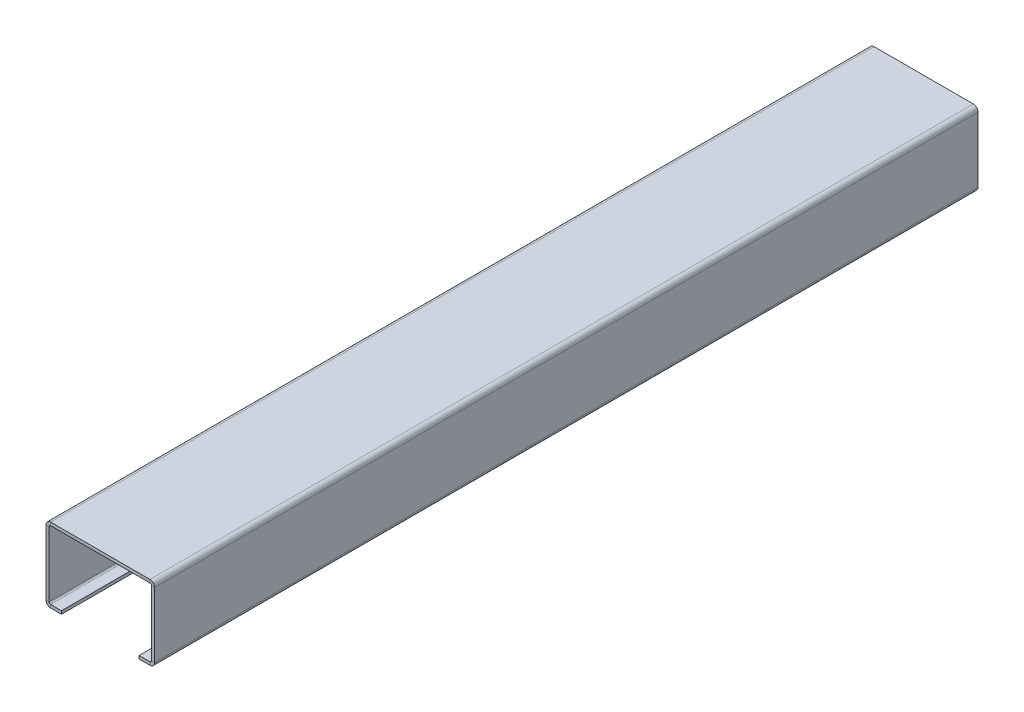
ISO-10303-21;
HEADER;
FILE_DESCRIPTION(('STEP AP214'),'2;1');
FILE_NAME('part.step','',(''),(''),'','','');
FILE_SCHEMA(('AUTOMOTIVE_DESIGN { 1 0 10303 214 1 1 1 1 }'));
ENDSEC;
DATA;
#1=APPLICATION_CONTEXT('core data for automotive mechanical design processes');
#2=APPLICATION_PROTOCOL_DEFINITION('international standard','automotive_design',2000,#1);
#3=PRODUCT_CONTEXT('',#1,'mechanical');
#4=PRODUCT('Part','Part','',(#3));
#5=PRODUCT_RELATED_PRODUCT_CATEGORY('part','',(#4));
#6=PRODUCT_DEFINITION_FORMATION('','',#4);
#7=PRODUCT_DEFINITION_CONTEXT('part definition',#1,'design');
#8=PRODUCT_DEFINITION('design','',#6,#7);
#9=PRODUCT_DEFINITION_SHAPE('','',#8);
#10=(LENGTH_UNIT() NAMED_UNIT(*) SI_UNIT(.MILLI.,.METRE.));
#11=(NAMED_UNIT(*) PLANE_ANGLE_UNIT() SI_UNIT($,.RADIAN.));
#12=(NAMED_UNIT(*) SI_UNIT($,.STERADIAN.) SOLID_ANGLE_UNIT());
#13=UNCERTAINTY_MEASURE_WITH_UNIT(LENGTH_MEASURE(1.E-05),#10,'distance_accuracy_value','');
#14=(GEOMETRIC_REPRESENTATION_CONTEXT(3) GLOBAL_UNCERTAINTY_ASSIGNED_CONTEXT((#13)) GLOBAL_UNIT_ASSIGNED_CONTEXT((#10,
#11,#12)) REPRESENTATION_CONTEXT('',''));
#15=CARTESIAN_POINT('',(0.,0.,0.));
#16=DIRECTION('',(0.,0.,1.));
#17=DIRECTION('',(1.,0.,0.));
#18=AXIS2_PLACEMENT_3D('',#15,#16,#17);
#19=CARTESIAN_POINT('',(35.0000000000004,-48.,531.));
#20=DIRECTION('',(0.,0.,1.));
#21=DIRECTION('',(1.,0.,0.));
#22=AXIS2_PLACEMENT_3D('',#19,#20,#21);
#23=PLANE('',#22);
#24=DIRECTION('',(0.,1.,0.));
#25=VECTOR('',#24,1.);
#26=CARTESIAN_POINT('',(33.0000000000002,1.21430643318377E-13,531.));
#27=LINE('',#26,#25);
#28=CARTESIAN_POINT('',(33.0000000000004,-45.,531.));
#29=VERTEX_POINT('',#28);
#30=CARTESIAN_POINT('',(33.,-2.99999999999999,531.));
#31=VERTEX_POINT('',#30);
#32=EDGE_CURVE('E376',#29,#31,#27,.T.);
#33=ORIENTED_EDGE('',*,*,#32,.F.);
#34=DIRECTION('',(1.,0.,0.));
#35=VECTOR('',#34,1.);
#36=CARTESIAN_POINT('',(33.0000000000003,-45.,531.));
#37=LINE('',#36,#35);
#38=CARTESIAN_POINT('',(35.0000000000003,-45.,531.));
#39=VERTEX_POINT('',#38);
#40=EDGE_CURVE('E304',#29,#39,#37,.T.);
#41=ORIENTED_EDGE('',*,*,#40,.T.);
#42=DIRECTION('',(0.,-1.,0.));
#43=VECTOR('',#42,1.);
#44=CARTESIAN_POINT('',(35.0000000000004,-48.,531.));
#45=LINE('',#44,#43);
#46=CARTESIAN_POINT('',(35.0000000000003,-2.99999999999998,531.));
#47=VERTEX_POINT('',#46);
#48=EDGE_CURVE('E370',#39,#47,#45,.F.);
#49=ORIENTED_EDGE('',*,*,#48,.T.);
#50=DIRECTION('',(1.,0.,0.));
#51=VECTOR('',#50,1.);
#52=CARTESIAN_POINT('',(33.0000000000003,-2.99999999999998,531.));
#53=LINE('',#52,#51);
#54=EDGE_CURVE('E382',#31,#47,#53,.T.);
#55=ORIENTED_EDGE('',*,*,#54,.F.);
#56=EDGE_LOOP('',(#33,#41,#49,#55));
#57=FACE_BOUND('',#56,.T.);
#58=ADVANCED_FACE('F118',(#57),#23,.T.);
#59=CARTESIAN_POINT('',(35.,1.28413605996063E-13,0.));
#60=DIRECTION('',(-1.,0.,0.));
#61=DIRECTION('',(0.,-1.,0.));
#62=AXIS2_PLACEMENT_3D('',#59,#60,#61);
#63=PLANE('',#62);
#64=DIRECTION('',(0.,0.,1.));
#65=VECTOR('',#64,1.);
#66=CARTESIAN_POINT('',(35.0000000000003,-45.,531.));
#67=LINE('',#66,#65);
#68=CARTESIAN_POINT('',(35.0000000000002,-45.,0.));
#69=VERTEX_POINT('',#68);
#70=EDGE_CURVE('E298',#39,#69,#67,.F.);
#71=ORIENTED_EDGE('',*,*,#70,.T.);
#72=DIRECTION('',(0.,1.,0.));
#73=VECTOR('',#72,1.);
#74=CARTESIAN_POINT('',(35.,-1.99999999999999,0.));
#75=LINE('',#74,#73);
#76=CARTESIAN_POINT('',(35.,-2.99999999999998,0.));
#77=VERTEX_POINT('',#76);
#78=EDGE_CURVE('E373',#77,#69,#75,.F.);
#79=ORIENTED_EDGE('',*,*,#78,.F.);
#80=DIRECTION('',(0.,0.,1.));
#81=VECTOR('',#80,1.);
#82=CARTESIAN_POINT('',(35.,-2.99999999999999,0.));
#83=LINE('',#82,#81);
#84=EDGE_CURVE('E380',#47,#77,#83,.F.);
#85=ORIENTED_EDGE('',*,*,#84,.F.);
#86=ORIENTED_EDGE('',*,*,#48,.F.);
#87=EDGE_LOOP('',(#71,#79,#85,#86));
#88=FACE_BOUND('',#87,.T.);
#89=ADVANCED_FACE('F539',(#88),#63,.F.);
#90=CARTESIAN_POINT('',(33.,1.21430643318376E-13,0.));
#91=DIRECTION('',(-1.,0.,0.));
#92=DIRECTION('',(0.,-1.,0.));
#93=AXIS2_PLACEMENT_3D('',#90,#91,#92);
#94=PLANE('',#93);
#95=DIRECTION('',(0.,-1.,0.));
#96=VECTOR('',#95,1.);
#97=CARTESIAN_POINT('',(33.,1.21430643318376E-13,0.));
#98=LINE('',#97,#96);
#99=CARTESIAN_POINT('',(33.,-2.99999999999999,0.));
#100=VERTEX_POINT('',#99);
#101=CARTESIAN_POINT('',(33.0000000000003,-45.,0.));
#102=VERTEX_POINT('',#101);
#103=EDGE_CURVE('E378',#100,#102,#98,.T.);
#104=ORIENTED_EDGE('',*,*,#103,.T.);
#105=DIRECTION('',(0.,0.,1.));
#106=VECTOR('',#105,1.);
#107=CARTESIAN_POINT('',(33.0000000000003,-45.,531.));
#108=LINE('',#107,#106);
#109=EDGE_CURVE('E135',#29,#102,#108,.F.);
#110=ORIENTED_EDGE('',*,*,#109,.F.);
#111=ORIENTED_EDGE('',*,*,#32,.T.);
#112=DIRECTION('',(0.,0.,1.));
#113=VECTOR('',#112,1.);
#114=CARTESIAN_POINT('',(33.,-3.,0.));
#115=LINE('',#114,#113);
#116=EDGE_CURVE('E385',#100,#31,#115,.T.);
#117=ORIENTED_EDGE('',*,*,#116,.F.);
#118=EDGE_LOOP('',(#104,#110,#111,#117));
#119=FACE_BOUND('',#118,.T.);
#120=ADVANCED_FACE('F511',(#119),#94,.T.);
#121=CARTESIAN_POINT('',(-35.,-1.99999999999999,0.));
#122=DIRECTION('',(0.,0.,-1.));
#123=DIRECTION('',(-1.,0.,0.));
#124=AXIS2_PLACEMENT_3D('',#121,#122,#123);
#125=PLANE('',#124);
#126=DIRECTION('',(0.,-1.,0.));
#127=VECTOR('',#126,1.);
#128=CARTESIAN_POINT('',(-33.,1.21430643318376E-13,0.));
#129=LINE('',#128,#127);
#130=CARTESIAN_POINT('',(-33.0000000000001,-45.,0.));
#131=VERTEX_POINT('',#130);
#132=CARTESIAN_POINT('',(-32.9999999999999,-2.99999999999999,0.));
#133=VERTEX_POINT('',#132);
#134=EDGE_CURVE('E419',#131,#133,#129,.F.);
#135=ORIENTED_EDGE('',*,*,#134,.F.);
#136=DIRECTION('',(-1.,0.,0.));
#137=VECTOR('',#136,1.);
#138=CARTESIAN_POINT('',(-33.0000000000001,-45.,0.));
#139=LINE('',#138,#137);
#140=CARTESIAN_POINT('',(-35.0000000000001,-45.,0.));
#141=VERTEX_POINT('',#140);
#142=EDGE_CURVE('E355',#131,#141,#139,.T.);
#143=ORIENTED_EDGE('',*,*,#142,.T.);
#144=DIRECTION('',(0.,1.,0.));
#145=VECTOR('',#144,1.);
#146=CARTESIAN_POINT('',(-35.,-1.99999999999999,0.));
#147=LINE('',#146,#145);
#148=CARTESIAN_POINT('',(-35.,-2.99999999999997,0.));
#149=VERTEX_POINT('',#148);
#150=EDGE_CURVE('E413',#141,#149,#147,.T.);
#151=ORIENTED_EDGE('',*,*,#150,.T.);
#152=DIRECTION('',(-1.,0.,0.));
#153=VECTOR('',#152,1.);
#154=CARTESIAN_POINT('',(-33.,-2.99999999999998,0.));
#155=LINE('',#154,#153);
#156=EDGE_CURVE('E427',#133,#149,#155,.T.);
#157=ORIENTED_EDGE('',*,*,#156,.F.);
#158=EDGE_LOOP('',(#135,#143,#151,#157));
#159=FACE_BOUND('',#158,.T.);
#160=ADVANCED_FACE('F574',(#159),#125,.T.);
#161=CARTESIAN_POINT('',(-35.,1.28413605996063E-13,0.));
#162=DIRECTION('',(-1.,0.,0.));
#163=DIRECTION('',(0.,-1.,0.));
#164=AXIS2_PLACEMENT_3D('',#161,#162,#163);
#165=PLANE('',#164);
#166=ORIENTED_EDGE('',*,*,#150,.F.);
#167=DIRECTION('',(0.,0.,-1.));
#168=VECTOR('',#167,1.);
#169=CARTESIAN_POINT('',(-35.0000000000001,-45.,0.));
#170=LINE('',#169,#168);
#171=CARTESIAN_POINT('',(-35.0000000000001,-45.,531.));
#172=VERTEX_POINT('',#171);
#173=EDGE_CURVE('E350',#141,#172,#170,.F.);
#174=ORIENTED_EDGE('',*,*,#173,.T.);
#175=DIRECTION('',(0.,-1.,0.));
#176=VECTOR('',#175,1.);
#177=CARTESIAN_POINT('',(-35.0000000000001,-48.,531.));
#178=LINE('',#177,#176);
#179=CARTESIAN_POINT('',(-34.9999999999999,-2.99999999999998,531.));
#180=VERTEX_POINT('',#179);
#181=EDGE_CURVE('E416',#180,#172,#178,.T.);
#182=ORIENTED_EDGE('',*,*,#181,.F.);
#183=DIRECTION('',(0.,0.,-1.));
#184=VECTOR('',#183,1.);
#185=CARTESIAN_POINT('',(-35.,-2.99999999999997,0.));
#186=LINE('',#185,#184);
#187=EDGE_CURVE('E424',#180,#149,#186,.T.);
#188=ORIENTED_EDGE('',*,*,#187,.T.);
#189=EDGE_LOOP('',(#166,#174,#182,#188));
#190=FACE_BOUND('',#189,.T.);
#191=ADVANCED_FACE('F480',(#190),#165,.T.);
#192=CARTESIAN_POINT('',(-33.,1.21430643318376E-13,0.));
#193=DIRECTION('',(-1.,0.,0.));
#194=DIRECTION('',(0.,-1.,0.));
#195=AXIS2_PLACEMENT_3D('',#192,#193,#194);
#196=PLANE('',#195);
#197=DIRECTION('',(0.,0.,-1.));
#198=VECTOR('',#197,1.);
#199=CARTESIAN_POINT('',(-33.0000000000001,-45.,0.));
#200=LINE('',#199,#198);
#201=CARTESIAN_POINT('',(-33.0000000000001,-45.,531.));
#202=VERTEX_POINT('',#201);
#203=EDGE_CURVE('E361',#131,#202,#200,.F.);
#204=ORIENTED_EDGE('',*,*,#203,.F.);
#205=ORIENTED_EDGE('',*,*,#134,.T.);
#206=DIRECTION('',(0.,0.,1.));
#207=VECTOR('',#206,1.);
#208=CARTESIAN_POINT('',(-32.9999999999999,-3.,531.));
#209=LINE('',#208,#207);
#210=CARTESIAN_POINT('',(-32.9999999999999,-2.99999999999999,531.));
#211=VERTEX_POINT('',#210);
#212=EDGE_CURVE('E430',#211,#133,#209,.F.);
#213=ORIENTED_EDGE('',*,*,#212,.F.);
#214=DIRECTION('',(0.,1.,0.));
#215=VECTOR('',#214,1.);
#216=CARTESIAN_POINT('',(-32.9999999999999,1.21430643318376E-13,531.));
#217=LINE('',#216,#215);
#218=EDGE_CURVE('E421',#211,#202,#217,.F.);
#219=ORIENTED_EDGE('',*,*,#218,.T.);
#220=EDGE_LOOP('',(#204,#205,#213,#219));
#221=FACE_BOUND('',#220,.T.);
#222=ADVANCED_FACE('F491',(#221),#196,.F.);
#223=CARTESIAN_POINT('',(0.,-2.,0.));
#224=DIRECTION('',(0.,-1.,0.));
#225=DIRECTION('',(0.,0.,-1.));
#226=AXIS2_PLACEMENT_3D('',#223,#224,#225);
#227=PLANE('',#226);
#228=DIRECTION('',(-1.,0.,0.));
#229=VECTOR('',#228,1.);
#230=CARTESIAN_POINT('',(35.,-2.,0.));
#231=LINE('',#230,#229);
#232=CARTESIAN_POINT('',(32.0000000000003,-2.00000000000012,0.));
#233=VERTEX_POINT('',#232);
#234=CARTESIAN_POINT('',(-32.,-2.,0.));
#235=VERTEX_POINT('',#234);
#236=EDGE_CURVE('E13',#233,#235,#231,.T.);
#237=ORIENTED_EDGE('',*,*,#236,.F.);
#238=DIRECTION('',(0.,0.,1.));
#239=VECTOR('',#238,1.);
#240=CARTESIAN_POINT('',(32.0000000000003,-2.00000000000012,531.));
#241=LINE('',#240,#239);
#242=CARTESIAN_POINT('',(32.0000000000003,-2.00000000000012,531.));
#243=VERTEX_POINT('',#242);
#244=EDGE_CURVE('E402',#243,#233,#241,.F.);
#245=ORIENTED_EDGE('',*,*,#244,.F.);
#246=DIRECTION('',(1.,0.,0.));
#247=VECTOR('',#246,1.);
#248=CARTESIAN_POINT('',(35.0000000000003,-2.,531.));
#249=LINE('',#248,#247);
#250=CARTESIAN_POINT('',(-32.,-2.,531.));
#251=VERTEX_POINT('',#250);
#252=EDGE_CURVE('E127',#251,#243,#249,.T.);
#253=ORIENTED_EDGE('',*,*,#252,.F.);
#254=DIRECTION('',(0.,0.,-1.));
#255=VECTOR('',#254,1.);
#256=CARTESIAN_POINT('',(-32.,-2.00000000000002,0.));
#257=LINE('',#256,#255);
#258=EDGE_CURVE('E447',#235,#251,#257,.F.);
#259=ORIENTED_EDGE('',*,*,#258,.F.);
#260=EDGE_LOOP('',(#237,#245,#253,#259));
#261=FACE_BOUND('',#260,.T.);
#262=ADVANCED_FACE('F498',(#261),#227,.T.);
#263=CARTESIAN_POINT('',(0.,0.,0.));
#264=DIRECTION('',(0.,-1.,0.));
#265=DIRECTION('',(0.,0.,-1.));
#266=AXIS2_PLACEMENT_3D('',#263,#264,#265);
#267=PLANE('',#266);
#268=DIRECTION('',(0.,0.,1.));
#269=VECTOR('',#268,1.);
#270=CARTESIAN_POINT('',(32.0000000000005,-1.16226472890446E-13,531.));
#271=LINE('',#270,#269);
#272=CARTESIAN_POINT('',(32.0000000000005,-1.16226472890446E-13,531.));
#273=VERTEX_POINT('',#272);
#274=CARTESIAN_POINT('',(32.0000000000003,0.,0.));
#275=VERTEX_POINT('',#274);
#276=EDGE_CURVE('E390',#273,#275,#271,.F.);
#277=ORIENTED_EDGE('',*,*,#276,.T.);
#278=DIRECTION('',(-1.,0.,0.));
#279=VECTOR('',#278,1.);
#280=CARTESIAN_POINT('',(35.,0.,0.));
#281=LINE('',#280,#279);
#282=CARTESIAN_POINT('',(-32.0000000000001,0.,0.));
#283=VERTEX_POINT('',#282);
#284=EDGE_CURVE('E122',#275,#283,#281,.T.);
#285=ORIENTED_EDGE('',*,*,#284,.T.);
#286=DIRECTION('',(0.,0.,-1.));
#287=VECTOR('',#286,1.);
#288=CARTESIAN_POINT('',(-32.0000000000001,0.,0.));
#289=LINE('',#288,#287);
#290=CARTESIAN_POINT('',(-32.,0.,531.));
#291=VERTEX_POINT('',#290);
#292=EDGE_CURVE('E435',#283,#291,#289,.F.);
#293=ORIENTED_EDGE('',*,*,#292,.T.);
#294=DIRECTION('',(1.,0.,0.));
#295=VECTOR('',#294,1.);
#296=CARTESIAN_POINT('',(35.0000000000003,0.,531.));
#297=LINE('',#296,#295);
#298=EDGE_CURVE('E455',#291,#273,#297,.T.);
#299=ORIENTED_EDGE('',*,*,#298,.T.);
#300=EDGE_LOOP('',(#277,#285,#293,#299));
#301=FACE_BOUND('',#300,.T.);
#302=ADVANCED_FACE('F463',(#301),#267,.F.);
#303=CARTESIAN_POINT('',(35.0000000000003,-2.,531.));
#304=DIRECTION('',(0.,0.,1.));
#305=DIRECTION('',(1.,0.,0.));
#306=AXIS2_PLACEMENT_3D('',#303,#304,#305);
#307=PLANE('',#306);
#308=ORIENTED_EDGE('',*,*,#252,.T.);
#309=DIRECTION('',(1.24900090270346E-13,1.,0.));
#310=VECTOR('',#309,1.);
#311=CARTESIAN_POINT('',(32.0000000000003,-2.00000000000012,531.));
#312=LINE('',#311,#310);
#313=EDGE_CURVE('E396',#243,#273,#312,.T.);
#314=ORIENTED_EDGE('',*,*,#313,.T.);
#315=ORIENTED_EDGE('',*,*,#298,.F.);
#316=DIRECTION('',(0.,1.,0.));
#317=VECTOR('',#316,1.);
#318=CARTESIAN_POINT('',(-32.,-2.00000000000002,531.));
#319=LINE('',#318,#317);
#320=EDGE_CURVE('E452',#251,#291,#319,.T.);
#321=ORIENTED_EDGE('',*,*,#320,.F.);
#322=EDGE_LOOP('',(#308,#314,#315,#321));
#323=FACE_BOUND('',#322,.T.);
#324=ADVANCED_FACE('F120',(#323),#307,.T.);
#325=CARTESIAN_POINT('',(35.,-2.,0.));
#326=DIRECTION('',(0.,0.,-1.));
#327=DIRECTION('',(-1.,0.,0.));
#328=AXIS2_PLACEMENT_3D('',#325,#326,#327);
#329=PLANE('',#328);
#330=DIRECTION('',(1.24900090270346E-13,1.,0.));
#331=VECTOR('',#330,1.);
#332=CARTESIAN_POINT('',(32.0000000000003,-2.00000000000012,0.));
#333=LINE('',#332,#331);
#334=EDGE_CURVE('E407',#233,#275,#333,.T.);
#335=ORIENTED_EDGE('',*,*,#334,.F.);
#336=ORIENTED_EDGE('',*,*,#236,.T.);
#337=DIRECTION('',(0.,1.,0.));
#338=VECTOR('',#337,1.);
#339=CARTESIAN_POINT('',(-32.,-2.00000000000002,0.));
#340=LINE('',#339,#338);
#341=EDGE_CURVE('E441',#235,#283,#340,.T.);
#342=ORIENTED_EDGE('',*,*,#341,.T.);
#343=ORIENTED_EDGE('',*,*,#284,.F.);
#344=EDGE_LOOP('',(#335,#336,#342,#343));
#345=FACE_BOUND('',#344,.T.);
#346=ADVANCED_FACE('F545',(#345),#329,.T.);
#347=CARTESIAN_POINT('',(-32.,-2.99999999999999,531.));
#348=DIRECTION('',(0.,0.,1.));
#349=DIRECTION('',(1.,0.,0.));
#350=AXIS2_PLACEMENT_3D('',#347,#348,#349);
#351=PLANE('',#350);
#352=DIRECTION('',(-1.,0.,0.));
#353=VECTOR('',#352,1.);
#354=CARTESIAN_POINT('',(-34.9999999999999,-2.99999999999999,531.));
#355=LINE('',#354,#353);
#356=EDGE_CURVE('E410',#211,#180,#355,.T.);
#357=ORIENTED_EDGE('',*,*,#356,.F.);
#358=CARTESIAN_POINT('',(-32.,-2.99999999999999,531.));
#359=DIRECTION('',(0.,0.,-1.));
#360=DIRECTION('',(-1.,0.,0.));
#361=AXIS2_PLACEMENT_3D('',#358,#359,#360);
#362=CIRCLE('',#361,0.999999999999966);
#363=EDGE_CURVE('E444',#251,#211,#362,.F.);
#364=ORIENTED_EDGE('',*,*,#363,.F.);
#365=ORIENTED_EDGE('',*,*,#320,.T.);
#366=CARTESIAN_POINT('',(-32.,-2.99999999999999,531.));
#367=DIRECTION('',(0.,0.,-1.));
#368=DIRECTION('',(-1.,0.,0.));
#369=AXIS2_PLACEMENT_3D('',#366,#367,#368);
#370=CIRCLE('',#369,2.99999999999997);
#371=EDGE_CURVE('E437',#291,#180,#370,.F.);
#372=ORIENTED_EDGE('',*,*,#371,.T.);
#373=EDGE_LOOP('',(#357,#364,#365,#372));
#374=FACE_BOUND('',#373,.T.);
#375=ADVANCED_FACE('F482',(#374),#351,.T.);
#376=CARTESIAN_POINT('',(-32.,-2.99999999999999,0.));
#377=DIRECTION('',(0.,0.,1.));
#378=DIRECTION('',(1.,0.,0.));
#379=AXIS2_PLACEMENT_3D('',#376,#377,#378);
#380=PLANE('',#379);
#381=CARTESIAN_POINT('',(-32.,-2.99999999999999,0.));
#382=DIRECTION('',(0.,0.,-1.));
#383=DIRECTION('',(-1.,0.,0.));
#384=AXIS2_PLACEMENT_3D('',#381,#382,#383);
#385=CIRCLE('',#384,0.999999999999966);
#386=EDGE_CURVE('E415',#133,#235,#385,.T.);
#387=ORIENTED_EDGE('',*,*,#386,.F.);
#388=ORIENTED_EDGE('',*,*,#156,.T.);
#389=CARTESIAN_POINT('',(-32.,-2.99999999999999,0.));
#390=DIRECTION('',(0.,0.,-1.));
#391=DIRECTION('',(-1.,0.,0.));
#392=AXIS2_PLACEMENT_3D('',#389,#390,#391);
#393=CIRCLE('',#392,2.99999999999997);
#394=EDGE_CURVE('E438',#149,#283,#393,.T.);
#395=ORIENTED_EDGE('',*,*,#394,.T.);
#396=ORIENTED_EDGE('',*,*,#341,.F.);
#397=EDGE_LOOP('',(#387,#388,#395,#396));
#398=FACE_BOUND('',#397,.T.);
#399=ADVANCED_FACE('F473',(#398),#380,.F.);
#400=CARTESIAN_POINT('',(-32.,-2.99999999999999,0.));
#401=DIRECTION('',(0.,0.,-1.));
#402=DIRECTION('',(-1.,0.,0.));
#403=AXIS2_PLACEMENT_3D('',#400,#401,#402);
#404=CYLINDRICAL_SURFACE('',#403,2.99999999999997);
#405=ORIENTED_EDGE('',*,*,#292,.F.);
#406=ORIENTED_EDGE('',*,*,#394,.F.);
#407=ORIENTED_EDGE('',*,*,#187,.F.);
#408=ORIENTED_EDGE('',*,*,#371,.F.);
#409=EDGE_LOOP('',(#405,#406,#407,#408));
#410=FACE_BOUND('',#409,.T.);
#411=ADVANCED_FACE('F469',(#410),#404,.T.);
#412=CARTESIAN_POINT('',(-32.,-2.99999999999999,0.));
#413=DIRECTION('',(0.,0.,-1.));
#414=DIRECTION('',(-1.,0.,0.));
#415=AXIS2_PLACEMENT_3D('',#412,#413,#414);
#416=CYLINDRICAL_SURFACE('',#415,0.999999999999966);
#417=ORIENTED_EDGE('',*,*,#258,.T.);
#418=ORIENTED_EDGE('',*,*,#363,.T.);
#419=ORIENTED_EDGE('',*,*,#212,.T.);
#420=ORIENTED_EDGE('',*,*,#386,.T.);
#421=EDGE_LOOP('',(#417,#418,#419,#420));
#422=FACE_BOUND('',#421,.T.);
#423=ADVANCED_FACE('F493',(#422),#416,.F.);
#424=CARTESIAN_POINT('',(-35.0000000000001,-48.,531.));
#425=DIRECTION('',(0.,0.,1.));
#426=DIRECTION('',(1.,0.,0.));
#427=AXIS2_PLACEMENT_3D('',#424,#425,#426);
#428=PLANE('',#427);
#429=DIRECTION('',(-1.,0.,0.));
#430=VECTOR('',#429,1.);
#431=CARTESIAN_POINT('',(-33.0000000000001,-45.,531.));
#432=LINE('',#431,#430);
#433=EDGE_CURVE('E365',#202,#172,#432,.T.);
#434=ORIENTED_EDGE('',*,*,#433,.F.);
#435=ORIENTED_EDGE('',*,*,#218,.F.);
#436=ORIENTED_EDGE('',*,*,#356,.T.);
#437=ORIENTED_EDGE('',*,*,#181,.T.);
#438=EDGE_LOOP('',(#434,#435,#436,#437));
#439=FACE_BOUND('',#438,.T.);
#440=ADVANCED_FACE('F487',(#439),#428,.T.);
#441=CARTESIAN_POINT('',(32.0000000000001,-2.99999999999999,0.));
#442=DIRECTION('',(0.,0.,-1.));
#443=DIRECTION('',(-1.,0.,0.));
#444=AXIS2_PLACEMENT_3D('',#441,#442,#443);
#445=PLANE('',#444);
#446=DIRECTION('',(1.,0.,0.));
#447=VECTOR('',#446,1.);
#448=CARTESIAN_POINT('',(35.,-2.99999999999999,0.));
#449=LINE('',#448,#447);
#450=EDGE_CURVE('E367',#100,#77,#449,.T.);
#451=ORIENTED_EDGE('',*,*,#450,.F.);
#452=CARTESIAN_POINT('',(32.0000000000001,-2.99999999999999,0.));
#453=DIRECTION('',(0.,0.,1.));
#454=DIRECTION('',(1.,0.,0.));
#455=AXIS2_PLACEMENT_3D('',#452,#453,#454);
#456=CIRCLE('',#455,0.999999999999876);
#457=EDGE_CURVE('E399',#233,#100,#456,.F.);
#458=ORIENTED_EDGE('',*,*,#457,.F.);
#459=ORIENTED_EDGE('',*,*,#334,.T.);
#460=CARTESIAN_POINT('',(32.0000000000001,-2.99999999999999,0.));
#461=DIRECTION('',(0.,0.,1.));
#462=DIRECTION('',(1.,0.,0.));
#463=AXIS2_PLACEMENT_3D('',#460,#461,#462);
#464=CIRCLE('',#463,2.99999999999988);
#465=EDGE_CURVE('E392',#275,#77,#464,.F.);
#466=ORIENTED_EDGE('',*,*,#465,.T.);
#467=EDGE_LOOP('',(#451,#458,#459,#466));
#468=FACE_BOUND('',#467,.T.);
#469=ADVANCED_FACE('F544',(#468),#445,.T.);
#470=CARTESIAN_POINT('',(32.0000000000001,-2.99999999999999,531.));
#471=DIRECTION('',(0.,0.,-1.));
#472=DIRECTION('',(-1.,0.,0.));
#473=AXIS2_PLACEMENT_3D('',#470,#471,#472);
#474=PLANE('',#473);
#475=CARTESIAN_POINT('',(32.0000000000001,-2.99999999999999,531.));
#476=DIRECTION('',(0.,0.,1.));
#477=DIRECTION('',(1.,0.,0.));
#478=AXIS2_PLACEMENT_3D('',#475,#476,#477);
#479=CIRCLE('',#478,0.999999999999876);
#480=EDGE_CURVE('E372',#31,#243,#479,.T.);
#481=ORIENTED_EDGE('',*,*,#480,.F.);
#482=ORIENTED_EDGE('',*,*,#54,.T.);
#483=CARTESIAN_POINT('',(32.0000000000001,-2.99999999999999,531.));
#484=DIRECTION('',(0.,0.,1.));
#485=DIRECTION('',(1.,0.,0.));
#486=AXIS2_PLACEMENT_3D('',#483,#484,#485);
#487=CIRCLE('',#486,2.99999999999988);
#488=EDGE_CURVE('E393',#47,#273,#487,.T.);
#489=ORIENTED_EDGE('',*,*,#488,.T.);
#490=ORIENTED_EDGE('',*,*,#313,.F.);
#491=EDGE_LOOP('',(#481,#482,#489,#490));
#492=FACE_BOUND('',#491,.T.);
#493=ADVANCED_FACE('F503',(#492),#474,.F.);
#494=CARTESIAN_POINT('',(32.0000000000001,-2.99999999999999,531.));
#495=DIRECTION('',(0.,0.,1.));
#496=DIRECTION('',(1.,0.,0.));
#497=AXIS2_PLACEMENT_3D('',#494,#495,#496);
#498=CYLINDRICAL_SURFACE('',#497,2.99999999999988);
#499=ORIENTED_EDGE('',*,*,#276,.F.);
#500=ORIENTED_EDGE('',*,*,#488,.F.);
#501=ORIENTED_EDGE('',*,*,#84,.T.);
#502=ORIENTED_EDGE('',*,*,#465,.F.);
#503=EDGE_LOOP('',(#499,#500,#501,#502));
#504=FACE_BOUND('',#503,.T.);
#505=ADVANCED_FACE('F542',(#504),#498,.T.);
#506=CARTESIAN_POINT('',(32.0000000000001,-2.99999999999999,531.));
#507=DIRECTION('',(0.,0.,1.));
#508=DIRECTION('',(1.,0.,0.));
#509=AXIS2_PLACEMENT_3D('',#506,#507,#508);
#510=CYLINDRICAL_SURFACE('',#509,0.999999999999876);
#511=ORIENTED_EDGE('',*,*,#244,.T.);
#512=ORIENTED_EDGE('',*,*,#457,.T.);
#513=ORIENTED_EDGE('',*,*,#116,.T.);
#514=ORIENTED_EDGE('',*,*,#480,.T.);
#515=EDGE_LOOP('',(#511,#512,#513,#514));
#516=FACE_BOUND('',#515,.T.);
#517=ADVANCED_FACE('F507',(#516),#510,.F.);
#518=CARTESIAN_POINT('',(35.,-1.99999999999999,0.));
#519=DIRECTION('',(0.,0.,-1.));
#520=DIRECTION('',(-1.,0.,0.));
#521=AXIS2_PLACEMENT_3D('',#518,#519,#520);
#522=PLANE('',#521);
#523=DIRECTION('',(1.,0.,0.));
#524=VECTOR('',#523,1.);
#525=CARTESIAN_POINT('',(33.0000000000003,-45.,0.));
#526=LINE('',#525,#524);
#527=EDGE_CURVE('E314',#102,#69,#526,.T.);
#528=ORIENTED_EDGE('',*,*,#527,.F.);
#529=ORIENTED_EDGE('',*,*,#103,.F.);
#530=ORIENTED_EDGE('',*,*,#450,.T.);
#531=ORIENTED_EDGE('',*,*,#78,.T.);
#532=EDGE_LOOP('',(#528,#529,#530,#531));
#533=FACE_BOUND('',#532,.T.);
#534=ADVANCED_FACE('F513',(#533),#522,.T.);
#535=CARTESIAN_POINT('',(-32.0000000000001,-45.,531.));
#536=DIRECTION('',(0.,0.,1.));
#537=DIRECTION('',(1.,0.,0.));
#538=AXIS2_PLACEMENT_3D('',#535,#536,#537);
#539=PLANE('',#538);
#540=DIRECTION('',(0.,1.,0.));
#541=VECTOR('',#540,1.);
#542=CARTESIAN_POINT('',(-32.0000000000001,-48.,531.));
#543=LINE('',#542,#541);
#544=CARTESIAN_POINT('',(-32.0000000000001,-46.,531.));
#545=VERTEX_POINT('',#544);
#546=CARTESIAN_POINT('',(-32.0000000000001,-48.,531.));
#547=VERTEX_POINT('',#546);
#548=EDGE_CURVE('E317',#545,#547,#543,.F.);
#549=ORIENTED_EDGE('',*,*,#548,.F.);
#550=CARTESIAN_POINT('',(-32.0000000000001,-45.,531.));
#551=DIRECTION('',(0.,0.,-1.));
#552=DIRECTION('',(-1.,0.,0.));
#553=AXIS2_PLACEMENT_3D('',#550,#551,#552);
#554=CIRCLE('',#553,0.999999999999987);
#555=EDGE_CURVE('E358',#202,#545,#554,.F.);
#556=ORIENTED_EDGE('',*,*,#555,.F.);
#557=ORIENTED_EDGE('',*,*,#433,.T.);
#558=CARTESIAN_POINT('',(-32.0000000000001,-45.,531.));
#559=DIRECTION('',(0.,0.,-1.));
#560=DIRECTION('',(-1.,0.,0.));
#561=AXIS2_PLACEMENT_3D('',#558,#559,#560);
#562=CIRCLE('',#561,2.99999999999999);
#563=EDGE_CURVE('E143',#172,#547,#562,.F.);
#564=ORIENTED_EDGE('',*,*,#563,.T.);
#565=EDGE_LOOP('',(#549,#556,#557,#564));
#566=FACE_BOUND('',#565,.T.);
#567=ADVANCED_FACE('F563',(#566),#539,.T.);
#568=CARTESIAN_POINT('',(-32.0000000000001,-45.,0.));
#569=DIRECTION('',(0.,0.,1.));
#570=DIRECTION('',(1.,0.,0.));
#571=AXIS2_PLACEMENT_3D('',#568,#569,#570);
#572=PLANE('',#571);
#573=CARTESIAN_POINT('',(-32.0000000000001,-45.,0.));
#574=DIRECTION('',(0.,0.,-1.));
#575=DIRECTION('',(-1.,0.,0.));
#576=AXIS2_PLACEMENT_3D('',#573,#574,#575);
#577=CIRCLE('',#576,0.999999999999987);
#578=CARTESIAN_POINT('',(-32.0000000000001,-46.,0.));
#579=VERTEX_POINT('',#578);
#580=EDGE_CURVE('E323',#579,#131,#577,.T.);
#581=ORIENTED_EDGE('',*,*,#580,.F.);
#582=DIRECTION('',(0.,1.,0.));
#583=VECTOR('',#582,1.);
#584=CARTESIAN_POINT('',(-32.0000000000001,-46.,0.));
#585=LINE('',#584,#583);
#586=CARTESIAN_POINT('',(-32.0000000000002,-48.,0.));
#587=VERTEX_POINT('',#586);
#588=EDGE_CURVE('E343',#579,#587,#585,.F.);
#589=ORIENTED_EDGE('',*,*,#588,.T.);
#590=CARTESIAN_POINT('',(-32.0000000000001,-45.,0.));
#591=DIRECTION('',(0.,0.,-1.));
#592=DIRECTION('',(-1.,0.,0.));
#593=AXIS2_PLACEMENT_3D('',#590,#591,#592);
#594=CIRCLE('',#593,2.99999999999999);
#595=EDGE_CURVE('E353',#587,#141,#594,.T.);
#596=ORIENTED_EDGE('',*,*,#595,.T.);
#597=ORIENTED_EDGE('',*,*,#142,.F.);
#598=EDGE_LOOP('',(#581,#589,#596,#597));
#599=FACE_BOUND('',#598,.T.);
#600=ADVANCED_FACE('F718',(#599),#572,.F.);
#601=CARTESIAN_POINT('',(-32.0000000000001,-45.,0.));
#602=DIRECTION('',(0.,0.,-1.));
#603=DIRECTION('',(0.,-1.,0.));
#604=AXIS2_PLACEMENT_3D('',#601,#602,#603);
#605=CYLINDRICAL_SURFACE('',#604,2.99999999999999);
#606=ORIENTED_EDGE('',*,*,#173,.F.);
#607=ORIENTED_EDGE('',*,*,#595,.F.);
#608=DIRECTION('',(0.,0.,-1.));
#609=VECTOR('',#608,1.);
#610=CARTESIAN_POINT('',(-32.0000000000001,-48.,531.));
#611=LINE('',#610,#609);
#612=EDGE_CURVE('E341',#587,#547,#611,.F.);
#613=ORIENTED_EDGE('',*,*,#612,.T.);
#614=ORIENTED_EDGE('',*,*,#563,.F.);
#615=EDGE_LOOP('',(#606,#607,#613,#614));
#616=FACE_BOUND('',#615,.T.);
#617=ADVANCED_FACE('F728',(#616),#605,.T.);
#618=CARTESIAN_POINT('',(-32.0000000000001,-45.,0.));
#619=DIRECTION('',(0.,0.,-1.));
#620=DIRECTION('',(0.,-1.,0.));
#621=AXIS2_PLACEMENT_3D('',#618,#619,#620);
#622=CYLINDRICAL_SURFACE('',#621,0.999999999999987);
#623=ORIENTED_EDGE('',*,*,#203,.T.);
#624=ORIENTED_EDGE('',*,*,#555,.T.);
#625=DIRECTION('',(0.,0.,-1.));
#626=VECTOR('',#625,1.);
#627=CARTESIAN_POINT('',(-32.0000000000001,-46.,531.));
#628=LINE('',#627,#626);
#629=EDGE_CURVE('E346',#545,#579,#628,.T.);
#630=ORIENTED_EDGE('',*,*,#629,.T.);
#631=ORIENTED_EDGE('',*,*,#580,.T.);
#632=EDGE_LOOP('',(#623,#624,#630,#631));
#633=FACE_BOUND('',#632,.T.);
#634=ADVANCED_FACE('F739',(#633),#622,.F.);
#635=CARTESIAN_POINT('',(-25.0000000000002,-48.0000000000001,0.));
#636=DIRECTION('',(0.,0.,1.));
#637=DIRECTION('',(1.,0.,0.));
#638=AXIS2_PLACEMENT_3D('',#635,#636,#637);
#639=PLANE('',#638);
#640=ORIENTED_EDGE('',*,*,#588,.F.);
#641=DIRECTION('',(-1.,0.,0.));
#642=VECTOR('',#641,1.);
#643=CARTESIAN_POINT('',(-25.0000000000001,-46.0000000000001,0.));
#644=LINE('',#643,#642);
#645=CARTESIAN_POINT('',(-25.0000000000001,-46.0000000000001,0.));
#646=VERTEX_POINT('',#645);
#647=EDGE_CURVE('E339',#579,#646,#644,.F.);
#648=ORIENTED_EDGE('',*,*,#647,.T.);
#649=DIRECTION('',(0.,1.,0.));
#650=VECTOR('',#649,1.);
#651=CARTESIAN_POINT('',(-25.0000000000002,-48.0000000000001,0.));
#652=LINE('',#651,#650);
#653=CARTESIAN_POINT('',(-25.0000000000002,-48.0000000000001,0.));
#654=VERTEX_POINT('',#653);
#655=EDGE_CURVE('E320',#654,#646,#652,.T.);
#656=ORIENTED_EDGE('',*,*,#655,.F.);
#657=DIRECTION('',(1.,0.,0.));
#658=VECTOR('',#657,1.);
#659=CARTESIAN_POINT('',(-3.40049870065235E-13,-48.0000000000002,0.));
#660=LINE('',#659,#658);
#661=EDGE_CURVE('E332',#587,#654,#660,.T.);
#662=ORIENTED_EDGE('',*,*,#661,.F.);
#663=EDGE_LOOP('',(#640,#648,#656,#662));
#664=FACE_BOUND('',#663,.T.);
#665=ADVANCED_FACE('F749',(#664),#639,.F.);
#666=CARTESIAN_POINT('',(-33.0000000000001,-48.,531.));
#667=DIRECTION('',(0.,0.,-1.));
#668=DIRECTION('',(0.,1.,0.));
#669=AXIS2_PLACEMENT_3D('',#666,#667,#668);
#670=PLANE('',#669);
#671=ORIENTED_EDGE('',*,*,#548,.T.);
#672=DIRECTION('',(-1.,0.,0.));
#673=VECTOR('',#672,1.);
#674=CARTESIAN_POINT('',(-3.40049870065235E-13,-48.0000000000002,531.));
#675=LINE('',#674,#673);
#676=CARTESIAN_POINT('',(-25.0000000000001,-48.0000000000001,531.));
#677=VERTEX_POINT('',#676);
#678=EDGE_CURVE('E327',#677,#547,#675,.T.);
#679=ORIENTED_EDGE('',*,*,#678,.F.);
#680=DIRECTION('',(0.,1.,0.));
#681=VECTOR('',#680,1.);
#682=CARTESIAN_POINT('',(-25.0000000000001,-48.0000000000001,531.));
#683=LINE('',#682,#681);
#684=CARTESIAN_POINT('',(-25.0000000000001,-46.0000000000001,531.));
#685=VERTEX_POINT('',#684);
#686=EDGE_CURVE('E324',#677,#685,#683,.T.);
#687=ORIENTED_EDGE('',*,*,#686,.T.);
#688=DIRECTION('',(1.,0.,0.));
#689=VECTOR('',#688,1.);
#690=CARTESIAN_POINT('',(-33.0000000000001,-46.,531.));
#691=LINE('',#690,#689);
#692=EDGE_CURVE('E334',#685,#545,#691,.F.);
#693=ORIENTED_EDGE('',*,*,#692,.T.);
#694=EDGE_LOOP('',(#671,#679,#687,#693));
#695=FACE_BOUND('',#694,.T.);
#696=ADVANCED_FACE('F760',(#695),#670,.F.);
#697=CARTESIAN_POINT('',(-3.40049870065235E-13,-48.0000000000002,0.));
#698=DIRECTION('',(0.,1.,0.));
#699=DIRECTION('',(-1.,0.,0.));
#700=AXIS2_PLACEMENT_3D('',#697,#698,#699);
#701=PLANE('',#700);
#702=ORIENTED_EDGE('',*,*,#612,.F.);
#703=ORIENTED_EDGE('',*,*,#661,.T.);
#704=DIRECTION('',(0.,0.,1.));
#705=VECTOR('',#704,1.);
#706=CARTESIAN_POINT('',(-25.0000000000002,-48.0000000000001,0.));
#707=LINE('',#706,#705);
#708=EDGE_CURVE('E330',#654,#677,#707,.T.);
#709=ORIENTED_EDGE('',*,*,#708,.T.);
#710=ORIENTED_EDGE('',*,*,#678,.T.);
#711=EDGE_LOOP('',(#702,#703,#709,#710));
#712=FACE_BOUND('',#711,.T.);
#713=ADVANCED_FACE('F771',(#712),#701,.F.);
#714=CARTESIAN_POINT('',(-3.26128013483641E-13,-46.0000000000002,0.));
#715=DIRECTION('',(0.,1.,0.));
#716=DIRECTION('',(-1.,0.,0.));
#717=AXIS2_PLACEMENT_3D('',#714,#715,#716);
#718=PLANE('',#717);
#719=ORIENTED_EDGE('',*,*,#647,.F.);
#720=ORIENTED_EDGE('',*,*,#629,.F.);
#721=ORIENTED_EDGE('',*,*,#692,.F.);
#722=DIRECTION('',(0.,0.,-1.));
#723=VECTOR('',#722,1.);
#724=CARTESIAN_POINT('',(-25.0000000000001,-46.0000000000001,531.));
#725=LINE('',#724,#723);
#726=EDGE_CURVE('E337',#646,#685,#725,.F.);
#727=ORIENTED_EDGE('',*,*,#726,.F.);
#728=EDGE_LOOP('',(#719,#720,#721,#727));
#729=FACE_BOUND('',#728,.T.);
#730=ADVANCED_FACE('F782',(#729),#718,.T.);
#731=CARTESIAN_POINT('',(-25.0000000000001,-48.0000000000001,531.));
#732=DIRECTION('',(-1.,0.,0.));
#733=DIRECTION('',(0.,-1.,0.));
#734=AXIS2_PLACEMENT_3D('',#731,#732,#733);
#735=PLANE('',#734);
#736=ORIENTED_EDGE('',*,*,#726,.T.);
#737=ORIENTED_EDGE('',*,*,#686,.F.);
#738=ORIENTED_EDGE('',*,*,#708,.F.);
#739=ORIENTED_EDGE('',*,*,#655,.T.);
#740=EDGE_LOOP('',(#736,#737,#738,#739));
#741=FACE_BOUND('',#740,.T.);
#742=ADVANCED_FACE('F793',(#741),#735,.F.);
#743=CARTESIAN_POINT('',(32.0000000000003,-45.,0.));
#744=DIRECTION('',(0.,0.,-1.));
#745=DIRECTION('',(-1.,0.,0.));
#746=AXIS2_PLACEMENT_3D('',#743,#744,#745);
#747=PLANE('',#746);
#748=DIRECTION('',(0.,1.,0.));
#749=VECTOR('',#748,1.);
#750=CARTESIAN_POINT('',(32.0000000000002,-48.,0.));
#751=LINE('',#750,#749);
#752=CARTESIAN_POINT('',(32.0000000000003,-46.,0.));
#753=VERTEX_POINT('',#752);
#754=CARTESIAN_POINT('',(32.0000000000003,-48.,0.));
#755=VERTEX_POINT('',#754);
#756=EDGE_CURVE('E281',#753,#755,#751,.F.);
#757=ORIENTED_EDGE('',*,*,#756,.F.);
#758=CARTESIAN_POINT('',(32.0000000000003,-45.,0.));
#759=DIRECTION('',(0.,0.,1.));
#760=DIRECTION('',(1.,0.,0.));
#761=AXIS2_PLACEMENT_3D('',#758,#759,#760);
#762=CIRCLE('',#761,0.999999999999994);
#763=EDGE_CURVE('E307',#102,#753,#762,.F.);
#764=ORIENTED_EDGE('',*,*,#763,.F.);
#765=ORIENTED_EDGE('',*,*,#527,.T.);
#766=CARTESIAN_POINT('',(32.0000000000003,-45.,0.));
#767=DIRECTION('',(0.,0.,1.));
#768=DIRECTION('',(1.,0.,0.));
#769=AXIS2_PLACEMENT_3D('',#766,#767,#768);
#770=CIRCLE('',#769,2.99999999999999);
#771=EDGE_CURVE('E300',#69,#755,#770,.F.);
#772=ORIENTED_EDGE('',*,*,#771,.T.);
#773=EDGE_LOOP('',(#757,#764,#765,#772));
#774=FACE_BOUND('',#773,.T.);
#775=ADVANCED_FACE('F518',(#774),#747,.T.);
#776=CARTESIAN_POINT('',(32.0000000000003,-45.,531.));
#777=DIRECTION('',(0.,0.,-1.));
#778=DIRECTION('',(-1.,0.,0.));
#779=AXIS2_PLACEMENT_3D('',#776,#777,#778);
#780=PLANE('',#779);
#781=CARTESIAN_POINT('',(32.0000000000003,-45.,531.));
#782=DIRECTION('',(0.,0.,1.));
#783=DIRECTION('',(1.,0.,0.));
#784=AXIS2_PLACEMENT_3D('',#781,#782,#783);
#785=CIRCLE('',#784,0.999999999999994);
#786=CARTESIAN_POINT('',(32.0000000000003,-46.,531.));
#787=VERTEX_POINT('',#786);
#788=EDGE_CURVE('E311',#787,#29,#785,.T.);
#789=ORIENTED_EDGE('',*,*,#788,.F.);
#790=DIRECTION('',(0.,1.,0.));
#791=VECTOR('',#790,1.);
#792=CARTESIAN_POINT('',(32.0000000000004,-46.,531.));
#793=LINE('',#792,#791);
#794=CARTESIAN_POINT('',(32.0000000000004,-48.,531.));
#795=VERTEX_POINT('',#794);
#796=EDGE_CURVE('E292',#787,#795,#793,.F.);
#797=ORIENTED_EDGE('',*,*,#796,.T.);
#798=CARTESIAN_POINT('',(32.0000000000003,-45.,531.));
#799=DIRECTION('',(0.,0.,1.));
#800=DIRECTION('',(1.,0.,0.));
#801=AXIS2_PLACEMENT_3D('',#798,#799,#800);
#802=CIRCLE('',#801,2.99999999999999);
#803=EDGE_CURVE('E301',#795,#39,#802,.T.);
#804=ORIENTED_EDGE('',*,*,#803,.T.);
#805=ORIENTED_EDGE('',*,*,#40,.F.);
#806=EDGE_LOOP('',(#789,#797,#804,#805));
#807=FACE_BOUND('',#806,.T.);
#808=ADVANCED_FACE('F535',(#807),#780,.F.);
#809=CARTESIAN_POINT('',(32.0000000000003,-45.,531.));
#810=DIRECTION('',(0.,0.,1.));
#811=DIRECTION('',(0.,-1.,0.));
#812=AXIS2_PLACEMENT_3D('',#809,#810,#811);
#813=CYLINDRICAL_SURFACE('',#812,2.99999999999999);
#814=ORIENTED_EDGE('',*,*,#70,.F.);
#815=ORIENTED_EDGE('',*,*,#803,.F.);
#816=DIRECTION('',(0.,0.,1.));
#817=VECTOR('',#816,1.);
#818=CARTESIAN_POINT('',(32.0000000000002,-48.,0.));
#819=LINE('',#818,#817);
#820=EDGE_CURVE('E290',#795,#755,#819,.F.);
#821=ORIENTED_EDGE('',*,*,#820,.T.);
#822=ORIENTED_EDGE('',*,*,#771,.F.);
#823=EDGE_LOOP('',(#814,#815,#821,#822));
#824=FACE_BOUND('',#823,.T.);
#825=ADVANCED_FACE('F521',(#824),#813,.T.);
#826=CARTESIAN_POINT('',(32.0000000000003,-45.,531.));
#827=DIRECTION('',(0.,0.,1.));
#828=DIRECTION('',(0.,-1.,0.));
#829=AXIS2_PLACEMENT_3D('',#826,#827,#828);
#830=CYLINDRICAL_SURFACE('',#829,0.999999999999994);
#831=ORIENTED_EDGE('',*,*,#109,.T.);
#832=ORIENTED_EDGE('',*,*,#763,.T.);
#833=DIRECTION('',(0.,0.,1.));
#834=VECTOR('',#833,1.);
#835=CARTESIAN_POINT('',(32.0000000000002,-46.,0.));
#836=LINE('',#835,#834);
#837=EDGE_CURVE('E295',#753,#787,#836,.T.);
#838=ORIENTED_EDGE('',*,*,#837,.T.);
#839=ORIENTED_EDGE('',*,*,#788,.T.);
#840=EDGE_LOOP('',(#831,#832,#838,#839));
#841=FACE_BOUND('',#840,.T.);
#842=ADVANCED_FACE('F532',(#841),#830,.F.);
#843=CARTESIAN_POINT('',(33.0000000000002,-48.,0.));
#844=DIRECTION('',(0.,0.,1.));
#845=DIRECTION('',(1.,0.,0.));
#846=AXIS2_PLACEMENT_3D('',#843,#844,#845);
#847=PLANE('',#846);
#848=ORIENTED_EDGE('',*,*,#756,.T.);
#849=DIRECTION('',(1.,0.,0.));
#850=VECTOR('',#849,1.);
#851=CARTESIAN_POINT('',(3.40049870065235E-13,-48.0000000000002,0.));
#852=LINE('',#851,#850);
#853=CARTESIAN_POINT('',(25.0000000000002,-48.0000000000001,0.));
#854=VERTEX_POINT('',#853);
#855=EDGE_CURVE('E262',#854,#755,#852,.T.);
#856=ORIENTED_EDGE('',*,*,#855,.F.);
#857=DIRECTION('',(0.,1.,0.));
#858=VECTOR('',#857,1.);
#859=CARTESIAN_POINT('',(25.0000000000002,-48.0000000000001,0.));
#860=LINE('',#859,#858);
#861=CARTESIAN_POINT('',(25.0000000000002,-46.0000000000001,0.));
#862=VERTEX_POINT('',#861);
#863=EDGE_CURVE('E268',#854,#862,#860,.T.);
#864=ORIENTED_EDGE('',*,*,#863,.T.);
#865=DIRECTION('',(-1.,0.,0.));
#866=VECTOR('',#865,1.);
#867=CARTESIAN_POINT('',(33.0000000000002,-46.,0.));
#868=LINE('',#867,#866);
#869=EDGE_CURVE('E288',#862,#753,#868,.F.);
#870=ORIENTED_EDGE('',*,*,#869,.T.);
#871=EDGE_LOOP('',(#848,#856,#864,#870));
#872=FACE_BOUND('',#871,.T.);
#873=ADVANCED_FACE('F280',(#872),#847,.F.);
#874=CARTESIAN_POINT('',(25.0000000000004,-48.0000000000001,531.));
#875=DIRECTION('',(0.,0.,-1.));
#876=DIRECTION('',(0.,1.,0.));
#877=AXIS2_PLACEMENT_3D('',#874,#875,#876);
#878=PLANE('',#877);
#879=ORIENTED_EDGE('',*,*,#796,.F.);
#880=DIRECTION('',(1.,0.,0.));
#881=VECTOR('',#880,1.);
#882=CARTESIAN_POINT('',(25.0000000000004,-46.0000000000001,531.));
#883=LINE('',#882,#881);
#884=CARTESIAN_POINT('',(25.0000000000004,-46.0000000000001,531.));
#885=VERTEX_POINT('',#884);
#886=EDGE_CURVE('E284',#787,#885,#883,.F.);
#887=ORIENTED_EDGE('',*,*,#886,.T.);
#888=DIRECTION('',(0.,1.,0.));
#889=VECTOR('',#888,1.);
#890=CARTESIAN_POINT('',(25.0000000000004,-48.0000000000001,531.));
#891=LINE('',#890,#889);
#892=CARTESIAN_POINT('',(25.0000000000004,-48.0000000000001,531.));
#893=VERTEX_POINT('',#892);
#894=EDGE_CURVE('E277',#893,#885,#891,.T.);
#895=ORIENTED_EDGE('',*,*,#894,.F.);
#896=DIRECTION('',(-1.,0.,0.));
#897=VECTOR('',#896,1.);
#898=CARTESIAN_POINT('',(3.40049870065235E-13,-48.0000000000002,531.));
#899=LINE('',#898,#897);
#900=EDGE_CURVE('E264',#795,#893,#899,.T.);
#901=ORIENTED_EDGE('',*,*,#900,.F.);
#902=EDGE_LOOP('',(#879,#887,#895,#901));
#903=FACE_BOUND('',#902,.T.);
#904=ADVANCED_FACE('F524',(#903),#878,.F.);
#905=CARTESIAN_POINT('',(3.40049870065235E-13,-48.0000000000002,0.));
#906=DIRECTION('',(0.,1.,0.));
#907=DIRECTION('',(-1.,0.,0.));
#908=AXIS2_PLACEMENT_3D('',#905,#906,#907);
#909=PLANE('',#908);
#910=ORIENTED_EDGE('',*,*,#820,.F.);
#911=ORIENTED_EDGE('',*,*,#900,.T.);
#912=DIRECTION('',(0.,0.,-1.));
#913=VECTOR('',#912,1.);
#914=CARTESIAN_POINT('',(25.0000000000002,-48.0000000000001,0.));
#915=LINE('',#914,#913);
#916=EDGE_CURVE('E257',#893,#854,#915,.T.);
#917=ORIENTED_EDGE('',*,*,#916,.T.);
#918=ORIENTED_EDGE('',*,*,#855,.T.);
#919=EDGE_LOOP('',(#910,#911,#917,#918));
#920=FACE_BOUND('',#919,.T.);
#921=ADVANCED_FACE('F260',(#920),#909,.F.);
#922=CARTESIAN_POINT('',(3.26128013483641E-13,-46.0000000000002,0.));
#923=DIRECTION('',(0.,1.,0.));
#924=DIRECTION('',(-1.,0.,0.));
#925=AXIS2_PLACEMENT_3D('',#922,#923,#924);
#926=PLANE('',#925);
#927=ORIENTED_EDGE('',*,*,#886,.F.);
#928=ORIENTED_EDGE('',*,*,#837,.F.);
#929=ORIENTED_EDGE('',*,*,#869,.F.);
#930=DIRECTION('',(0.,0.,1.));
#931=VECTOR('',#930,1.);
#932=CARTESIAN_POINT('',(25.0000000000002,-46.0000000000001,0.));
#933=LINE('',#932,#931);
#934=EDGE_CURVE('E273',#885,#862,#933,.F.);
#935=ORIENTED_EDGE('',*,*,#934,.F.);
#936=EDGE_LOOP('',(#927,#928,#929,#935));
#937=FACE_BOUND('',#936,.T.);
#938=ADVANCED_FACE('F528',(#937),#926,.T.);
#939=CARTESIAN_POINT('',(25.0000000000002,-48.0000000000001,0.));
#940=DIRECTION('',(1.,0.,0.));
#941=DIRECTION('',(0.,1.,0.));
#942=AXIS2_PLACEMENT_3D('',#939,#940,#941);
#943=PLANE('',#942);
#944=ORIENTED_EDGE('',*,*,#934,.T.);
#945=ORIENTED_EDGE('',*,*,#863,.F.);
#946=ORIENTED_EDGE('',*,*,#916,.F.);
#947=ORIENTED_EDGE('',*,*,#894,.T.);
#948=EDGE_LOOP('',(#944,#945,#946,#947));
#949=FACE_BOUND('',#948,.T.);
#950=ADVANCED_FACE('F271',(#949),#943,.F.);
#951=CLOSED_SHELL('',(#58,#89,#120,#160,#191,#222,#262,#302,#324,#346,#375,#399,#411,#423,#440,
#469,#493,#505,#517,#534,#567,#600,#617,#634,#665,#696,#713,#730,#742,#775,#808,#825,#842,#873,
#904,#921,#938,#950));
#952=MANIFOLD_SOLID_BREP('B2',#951);
#953=ADVANCED_BREP_SHAPE_REPRESENTATION('',(#18,#952),#14);
#954=SHAPE_DEFINITION_REPRESENTATION(#9,#953);
ENDSEC;
END-ISO-10303-21;
